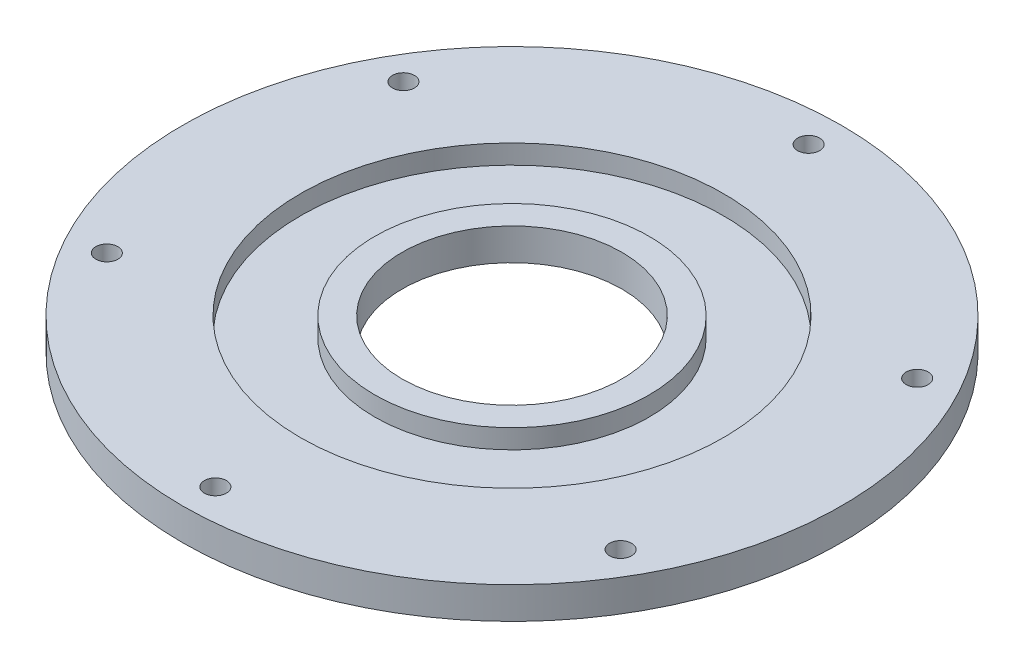
ISO-10303-21;
HEADER;
FILE_DESCRIPTION(('STEP AP214'),'2;1');
FILE_NAME('part.step','',(''),(''),'','','');
FILE_SCHEMA(('AUTOMOTIVE_DESIGN { 1 0 10303 214 1 1 1 1 }'));
ENDSEC;
DATA;
#1=APPLICATION_CONTEXT('core data for automotive mechanical design processes');
#2=APPLICATION_PROTOCOL_DEFINITION('international standard','automotive_design',2000,#1);
#3=PRODUCT_CONTEXT('',#1,'mechanical');
#4=PRODUCT('Part','Part','',(#3));
#5=PRODUCT_RELATED_PRODUCT_CATEGORY('part','',(#4));
#6=PRODUCT_DEFINITION_FORMATION('','',#4);
#7=PRODUCT_DEFINITION_CONTEXT('part definition',#1,'design');
#8=PRODUCT_DEFINITION('design','',#6,#7);
#9=PRODUCT_DEFINITION_SHAPE('','',#8);
#10=(LENGTH_UNIT() NAMED_UNIT(*) SI_UNIT(.MILLI.,.METRE.));
#11=(NAMED_UNIT(*) PLANE_ANGLE_UNIT() SI_UNIT($,.RADIAN.));
#12=(NAMED_UNIT(*) SI_UNIT($,.STERADIAN.) SOLID_ANGLE_UNIT());
#13=UNCERTAINTY_MEASURE_WITH_UNIT(LENGTH_MEASURE(1.E-05),#10,'distance_accuracy_value','');
#14=(GEOMETRIC_REPRESENTATION_CONTEXT(3) GLOBAL_UNCERTAINTY_ASSIGNED_CONTEXT((#13)) GLOBAL_UNIT_ASSIGNED_CONTEXT((#10,
#11,#12)) REPRESENTATION_CONTEXT('',''));
#15=CARTESIAN_POINT('',(0.,0.,0.));
#16=DIRECTION('',(0.,0.,1.));
#17=DIRECTION('',(1.,0.,0.));
#18=AXIS2_PLACEMENT_3D('',#15,#16,#17);
#19=CARTESIAN_POINT('',(0.,5.8,0.));
#20=DIRECTION('',(0.,1.,0.));
#21=DIRECTION('',(0.,0.,1.));
#22=AXIS2_PLACEMENT_3D('',#19,#20,#21);
#23=PLANE('',#22);
#24=CARTESIAN_POINT('',(0.,5.8,0.));
#25=DIRECTION('',(0.,1.,0.));
#26=DIRECTION('',(0.,0.,1.));
#27=AXIS2_PLACEMENT_3D('',#24,#25,#26);
#28=CIRCLE('',#27,20.);
#29=CARTESIAN_POINT('',(0.,5.8,20.));
#30=VERTEX_POINT('',#29);
#31=EDGE_CURVE('E43',#30,#30,#28,.T.);
#32=ORIENTED_EDGE('',*,*,#31,.F.);
#33=EDGE_LOOP('',(#32));
#34=FACE_BOUND('',#33,.T.);
#35=CARTESIAN_POINT('',(0.,5.8,0.));
#36=DIRECTION('',(0.,1.,0.));
#37=DIRECTION('',(0.,0.,1.));
#38=AXIS2_PLACEMENT_3D('',#35,#36,#37);
#39=CIRCLE('',#38,25.);
#40=CARTESIAN_POINT('',(0.,5.8,25.));
#41=VERTEX_POINT('',#40);
#42=EDGE_CURVE('E57',#41,#41,#39,.T.);
#43=ORIENTED_EDGE('',*,*,#42,.T.);
#44=EDGE_LOOP('',(#43));
#45=FACE_BOUND('',#44,.T.);
#46=ADVANCED_FACE('F32',(#34,#45),#23,.T.);
#47=CARTESIAN_POINT('',(0.,5.8,-54.));
#48=DIRECTION('',(0.,1.,0.));
#49=DIRECTION('',(0.,0.,1.));
#50=AXIS2_PLACEMENT_3D('',#47,#48,#49);
#51=CIRCLE('',#50,2.);
#52=CARTESIAN_POINT('',(0.,5.8,-52.));
#53=VERTEX_POINT('',#52);
#54=EDGE_CURVE('E88',#53,#53,#51,.T.);
#55=ORIENTED_EDGE('',*,*,#54,.F.);
#56=EDGE_LOOP('',(#55));
#57=FACE_BOUND('',#56,.T.);
#58=CARTESIAN_POINT('',(-46.7653718043585,5.8,-26.9999999999979));
#59=DIRECTION('',(0.,1.,0.));
#60=DIRECTION('',(0.,0.,1.));
#61=AXIS2_PLACEMENT_3D('',#58,#59,#60);
#62=CIRCLE('',#61,2.);
#63=CARTESIAN_POINT('',(-46.7653718043585,5.8,-24.9999999999979));
#64=VERTEX_POINT('',#63);
#65=EDGE_CURVE('E89',#64,#64,#62,.T.);
#66=ORIENTED_EDGE('',*,*,#65,.F.);
#67=EDGE_LOOP('',(#66));
#68=FACE_BOUND('',#67,.T.);
#69=CARTESIAN_POINT('',(-46.7653718043561,5.8,27.0000000000021));
#70=DIRECTION('',(0.,1.,0.));
#71=DIRECTION('',(0.,0.,1.));
#72=AXIS2_PLACEMENT_3D('',#69,#70,#71);
#73=CIRCLE('',#72,2.);
#74=CARTESIAN_POINT('',(-46.7653718043561,5.8,29.0000000000021));
#75=VERTEX_POINT('',#74);
#76=EDGE_CURVE('E63',#75,#75,#73,.T.);
#77=ORIENTED_EDGE('',*,*,#76,.F.);
#78=EDGE_LOOP('',(#77));
#79=FACE_BOUND('',#78,.T.);
#80=CARTESIAN_POINT('',(4.82268944919495E-12,5.8,54.));
#81=DIRECTION('',(0.,1.,0.));
#82=DIRECTION('',(0.,0.,1.));
#83=AXIS2_PLACEMENT_3D('',#80,#81,#82);
#84=CIRCLE('',#83,2.);
#85=CARTESIAN_POINT('',(4.82268944919495E-12,5.8,56.));
#86=VERTEX_POINT('',#85);
#87=EDGE_CURVE('E70',#86,#86,#84,.T.);
#88=ORIENTED_EDGE('',*,*,#87,.F.);
#89=EDGE_LOOP('',(#88));
#90=FACE_BOUND('',#89,.T.);
#91=CARTESIAN_POINT('',(46.7653718043633,5.8,26.9999999999979));
#92=DIRECTION('',(0.,1.,0.));
#93=DIRECTION('',(0.,0.,1.));
#94=AXIS2_PLACEMENT_3D('',#91,#92,#93);
#95=CIRCLE('',#94,2.);
#96=CARTESIAN_POINT('',(46.7653718043633,5.8,28.9999999999979));
#97=VERTEX_POINT('',#96);
#98=EDGE_CURVE('E76',#97,#97,#95,.T.);
#99=ORIENTED_EDGE('',*,*,#98,.F.);
#100=EDGE_LOOP('',(#99));
#101=FACE_BOUND('',#100,.T.);
#102=CARTESIAN_POINT('',(46.7653718043609,5.8,-27.0000000000021));
#103=DIRECTION('',(0.,1.,0.));
#104=DIRECTION('',(0.,0.,1.));
#105=AXIS2_PLACEMENT_3D('',#102,#103,#104);
#106=CIRCLE('',#105,2.);
#107=CARTESIAN_POINT('',(46.7653718043609,5.8,-25.0000000000021));
#108=VERTEX_POINT('',#107);
#109=EDGE_CURVE('E82',#108,#108,#106,.T.);
#110=ORIENTED_EDGE('',*,*,#109,.F.);
#111=EDGE_LOOP('',(#110));
#112=FACE_BOUND('',#111,.T.);
#113=CARTESIAN_POINT('',(0.,5.8,0.));
#114=DIRECTION('',(0.,1.,0.));
#115=DIRECTION('',(0.,0.,1.));
#116=AXIS2_PLACEMENT_3D('',#113,#114,#115);
#117=CIRCLE('',#116,38.5);
#118=CARTESIAN_POINT('',(0.,5.8,38.5));
#119=VERTEX_POINT('',#118);
#120=EDGE_CURVE('E51',#119,#119,#117,.T.);
#121=ORIENTED_EDGE('',*,*,#120,.F.);
#122=EDGE_LOOP('',(#121));
#123=FACE_BOUND('',#122,.T.);
#124=CARTESIAN_POINT('',(0.,5.8,0.));
#125=DIRECTION('',(0.,1.,0.));
#126=DIRECTION('',(0.,0.,1.));
#127=AXIS2_PLACEMENT_3D('',#124,#125,#126);
#128=CIRCLE('',#127,60.);
#129=CARTESIAN_POINT('',(0.,5.8,60.));
#130=VERTEX_POINT('',#129);
#131=EDGE_CURVE('E10',#130,#130,#128,.T.);
#132=ORIENTED_EDGE('',*,*,#131,.T.);
#133=EDGE_LOOP('',(#132));
#134=FACE_BOUND('',#133,.T.);
#135=ADVANCED_FACE('F109',(#57,#68,#79,#90,#101,#112,#123,#134),#23,.T.);
#136=CARTESIAN_POINT('',(0.,0.,0.));
#137=DIRECTION('',(0.,1.,0.));
#138=DIRECTION('',(0.,0.,1.));
#139=AXIS2_PLACEMENT_3D('',#136,#137,#138);
#140=PLANE('',#139);
#141=CARTESIAN_POINT('',(0.,0.,-54.));
#142=DIRECTION('',(0.,1.,0.));
#143=DIRECTION('',(0.,0.,1.));
#144=AXIS2_PLACEMENT_3D('',#141,#142,#143);
#145=CIRCLE('',#144,2.);
#146=CARTESIAN_POINT('',(0.,0.,-52.));
#147=VERTEX_POINT('',#146);
#148=EDGE_CURVE('E60',#147,#147,#145,.T.);
#149=ORIENTED_EDGE('',*,*,#148,.T.);
#150=EDGE_LOOP('',(#149));
#151=FACE_BOUND('',#150,.T.);
#152=CARTESIAN_POINT('',(-46.7653718043585,0.,-26.9999999999979));
#153=DIRECTION('',(0.,1.,0.));
#154=DIRECTION('',(0.,0.,1.));
#155=AXIS2_PLACEMENT_3D('',#152,#153,#154);
#156=CIRCLE('',#155,2.);
#157=CARTESIAN_POINT('',(-46.7653718043585,0.,-24.9999999999979));
#158=VERTEX_POINT('',#157);
#159=EDGE_CURVE('E67',#158,#158,#156,.T.);
#160=ORIENTED_EDGE('',*,*,#159,.T.);
#161=EDGE_LOOP('',(#160));
#162=FACE_BOUND('',#161,.T.);
#163=CARTESIAN_POINT('',(-46.7653718043561,0.,27.0000000000021));
#164=DIRECTION('',(0.,1.,0.));
#165=DIRECTION('',(0.,0.,1.));
#166=AXIS2_PLACEMENT_3D('',#163,#164,#165);
#167=CIRCLE('',#166,2.);
#168=CARTESIAN_POINT('',(-46.7653718043561,0.,29.0000000000021));
#169=VERTEX_POINT('',#168);
#170=EDGE_CURVE('E66',#169,#169,#167,.T.);
#171=ORIENTED_EDGE('',*,*,#170,.T.);
#172=EDGE_LOOP('',(#171));
#173=FACE_BOUND('',#172,.T.);
#174=CARTESIAN_POINT('',(4.82268944919495E-12,0.,54.));
#175=DIRECTION('',(0.,1.,0.));
#176=DIRECTION('',(0.,0.,1.));
#177=AXIS2_PLACEMENT_3D('',#174,#175,#176);
#178=CIRCLE('',#177,2.);
#179=CARTESIAN_POINT('',(4.82268944919495E-12,0.,56.));
#180=VERTEX_POINT('',#179);
#181=EDGE_CURVE('E73',#180,#180,#178,.T.);
#182=ORIENTED_EDGE('',*,*,#181,.T.);
#183=EDGE_LOOP('',(#182));
#184=FACE_BOUND('',#183,.T.);
#185=CARTESIAN_POINT('',(46.7653718043633,0.,26.9999999999979));
#186=DIRECTION('',(0.,1.,0.));
#187=DIRECTION('',(0.,0.,1.));
#188=AXIS2_PLACEMENT_3D('',#185,#186,#187);
#189=CIRCLE('',#188,2.);
#190=CARTESIAN_POINT('',(46.7653718043633,0.,28.9999999999979));
#191=VERTEX_POINT('',#190);
#192=EDGE_CURVE('E79',#191,#191,#189,.T.);
#193=ORIENTED_EDGE('',*,*,#192,.T.);
#194=EDGE_LOOP('',(#193));
#195=FACE_BOUND('',#194,.T.);
#196=CARTESIAN_POINT('',(46.7653718043609,0.,-27.0000000000021));
#197=DIRECTION('',(0.,1.,0.));
#198=DIRECTION('',(0.,0.,1.));
#199=AXIS2_PLACEMENT_3D('',#196,#197,#198);
#200=CIRCLE('',#199,2.);
#201=CARTESIAN_POINT('',(46.7653718043609,0.,-25.0000000000021));
#202=VERTEX_POINT('',#201);
#203=EDGE_CURVE('E85',#202,#202,#200,.T.);
#204=ORIENTED_EDGE('',*,*,#203,.T.);
#205=EDGE_LOOP('',(#204));
#206=FACE_BOUND('',#205,.T.);
#207=CARTESIAN_POINT('',(0.,0.,0.));
#208=DIRECTION('',(0.,1.,0.));
#209=DIRECTION('',(0.,0.,1.));
#210=AXIS2_PLACEMENT_3D('',#207,#208,#209);
#211=CIRCLE('',#210,60.);
#212=CARTESIAN_POINT('',(0.,0.,60.));
#213=VERTEX_POINT('',#212);
#214=EDGE_CURVE('E36',#213,#213,#211,.T.);
#215=ORIENTED_EDGE('',*,*,#214,.F.);
#216=EDGE_LOOP('',(#215));
#217=FACE_BOUND('',#216,.T.);
#218=CARTESIAN_POINT('',(0.,0.,0.));
#219=DIRECTION('',(0.,1.,0.));
#220=DIRECTION('',(0.,0.,1.));
#221=AXIS2_PLACEMENT_3D('',#218,#219,#220);
#222=CIRCLE('',#221,20.);
#223=CARTESIAN_POINT('',(0.,0.,20.));
#224=VERTEX_POINT('',#223);
#225=EDGE_CURVE('E45',#224,#224,#222,.T.);
#226=ORIENTED_EDGE('',*,*,#225,.T.);
#227=EDGE_LOOP('',(#226));
#228=FACE_BOUND('',#227,.T.);
#229=ADVANCED_FACE('F99',(#151,#162,#173,#184,#195,#206,#217,#228),#140,.F.);
#230=CARTESIAN_POINT('',(0.,5.8,0.));
#231=DIRECTION('',(0.,-1.,0.));
#232=DIRECTION('',(0.,0.,-1.));
#233=AXIS2_PLACEMENT_3D('',#230,#231,#232);
#234=CYLINDRICAL_SURFACE('',#233,60.);
#235=ORIENTED_EDGE('',*,*,#131,.F.);
#236=EDGE_LOOP('',(#235));
#237=FACE_BOUND('',#236,.T.);
#238=ORIENTED_EDGE('',*,*,#214,.T.);
#239=EDGE_LOOP('',(#238));
#240=FACE_BOUND('',#239,.T.);
#241=ADVANCED_FACE('F34',(#237,#240),#234,.T.);
#242=CARTESIAN_POINT('',(0.,5.8,0.));
#243=DIRECTION('',(0.,-1.,0.));
#244=DIRECTION('',(0.,0.,-1.));
#245=AXIS2_PLACEMENT_3D('',#242,#243,#244);
#246=CYLINDRICAL_SURFACE('',#245,20.);
#247=ORIENTED_EDGE('',*,*,#31,.T.);
#248=EDGE_LOOP('',(#247));
#249=FACE_BOUND('',#248,.T.);
#250=ORIENTED_EDGE('',*,*,#225,.F.);
#251=EDGE_LOOP('',(#250));
#252=FACE_BOUND('',#251,.T.);
#253=ADVANCED_FACE('F128',(#249,#252),#246,.F.);
#254=CARTESIAN_POINT('',(0.,2.3,0.));
#255=DIRECTION('',(0.,1.,0.));
#256=DIRECTION('',(0.,0.,1.));
#257=AXIS2_PLACEMENT_3D('',#254,#255,#256);
#258=CYLINDRICAL_SURFACE('',#257,38.5);
#259=CARTESIAN_POINT('',(0.,2.3,0.));
#260=DIRECTION('',(0.,1.,0.));
#261=DIRECTION('',(0.,0.,1.));
#262=AXIS2_PLACEMENT_3D('',#259,#260,#261);
#263=CIRCLE('',#262,38.5);
#264=CARTESIAN_POINT('',(0.,2.3,38.5));
#265=VERTEX_POINT('',#264);
#266=EDGE_CURVE('E48',#265,#265,#263,.T.);
#267=ORIENTED_EDGE('',*,*,#266,.F.);
#268=EDGE_LOOP('',(#267));
#269=FACE_BOUND('',#268,.T.);
#270=ORIENTED_EDGE('',*,*,#120,.T.);
#271=EDGE_LOOP('',(#270));
#272=FACE_BOUND('',#271,.T.);
#273=ADVANCED_FACE('F125',(#269,#272),#258,.F.);
#274=CARTESIAN_POINT('',(0.,2.3,0.));
#275=DIRECTION('',(0.,1.,0.));
#276=DIRECTION('',(0.,0.,1.));
#277=AXIS2_PLACEMENT_3D('',#274,#275,#276);
#278=PLANE('',#277);
#279=CARTESIAN_POINT('',(0.,2.3,0.));
#280=DIRECTION('',(0.,1.,0.));
#281=DIRECTION('',(0.,0.,1.));
#282=AXIS2_PLACEMENT_3D('',#279,#280,#281);
#283=CIRCLE('',#282,25.);
#284=CARTESIAN_POINT('',(0.,2.3,25.));
#285=VERTEX_POINT('',#284);
#286=EDGE_CURVE('E54',#285,#285,#283,.T.);
#287=ORIENTED_EDGE('',*,*,#286,.F.);
#288=EDGE_LOOP('',(#287));
#289=FACE_BOUND('',#288,.T.);
#290=ORIENTED_EDGE('',*,*,#266,.T.);
#291=EDGE_LOOP('',(#290));
#292=FACE_BOUND('',#291,.T.);
#293=ADVANCED_FACE('F127',(#289,#292),#278,.T.);
#294=CARTESIAN_POINT('',(0.,2.3,0.));
#295=DIRECTION('',(0.,1.,0.));
#296=DIRECTION('',(0.,0.,1.));
#297=AXIS2_PLACEMENT_3D('',#294,#295,#296);
#298=CYLINDRICAL_SURFACE('',#297,25.);
#299=ORIENTED_EDGE('',*,*,#286,.T.);
#300=EDGE_LOOP('',(#299));
#301=FACE_BOUND('',#300,.T.);
#302=ORIENTED_EDGE('',*,*,#42,.F.);
#303=EDGE_LOOP('',(#302));
#304=FACE_BOUND('',#303,.T.);
#305=ADVANCED_FACE('F135',(#301,#304),#298,.T.);
#306=CARTESIAN_POINT('',(46.7653718043609,0.,-27.0000000000021));
#307=DIRECTION('',(0.,1.,0.));
#308=DIRECTION('',(0.,0.,1.));
#309=AXIS2_PLACEMENT_3D('',#306,#307,#308);
#310=CYLINDRICAL_SURFACE('',#309,2.);
#311=ORIENTED_EDGE('',*,*,#203,.F.);
#312=EDGE_LOOP('',(#311));
#313=FACE_BOUND('',#312,.T.);
#314=ORIENTED_EDGE('',*,*,#109,.T.);
#315=EDGE_LOOP('',(#314));
#316=FACE_BOUND('',#315,.T.);
#317=ADVANCED_FACE('F187',(#313,#316),#310,.F.);
#318=CARTESIAN_POINT('',(46.7653718043633,0.,26.9999999999979));
#319=DIRECTION('',(0.,1.,0.));
#320=DIRECTION('',(0.,0.,1.));
#321=AXIS2_PLACEMENT_3D('',#318,#319,#320);
#322=CYLINDRICAL_SURFACE('',#321,2.);
#323=ORIENTED_EDGE('',*,*,#192,.F.);
#324=EDGE_LOOP('',(#323));
#325=FACE_BOUND('',#324,.T.);
#326=ORIENTED_EDGE('',*,*,#98,.T.);
#327=EDGE_LOOP('',(#326));
#328=FACE_BOUND('',#327,.T.);
#329=ADVANCED_FACE('F207',(#325,#328),#322,.F.);
#330=CARTESIAN_POINT('',(4.82268944919495E-12,0.,54.));
#331=DIRECTION('',(0.,1.,0.));
#332=DIRECTION('',(0.,0.,1.));
#333=AXIS2_PLACEMENT_3D('',#330,#331,#332);
#334=CYLINDRICAL_SURFACE('',#333,2.);
#335=ORIENTED_EDGE('',*,*,#181,.F.);
#336=EDGE_LOOP('',(#335));
#337=FACE_BOUND('',#336,.T.);
#338=ORIENTED_EDGE('',*,*,#87,.T.);
#339=EDGE_LOOP('',(#338));
#340=FACE_BOUND('',#339,.T.);
#341=ADVANCED_FACE('F217',(#337,#340),#334,.F.);
#342=CARTESIAN_POINT('',(-46.7653718043561,0.,27.0000000000021));
#343=DIRECTION('',(0.,1.,0.));
#344=DIRECTION('',(0.,0.,1.));
#345=AXIS2_PLACEMENT_3D('',#342,#343,#344);
#346=CYLINDRICAL_SURFACE('',#345,2.);
#347=ORIENTED_EDGE('',*,*,#170,.F.);
#348=EDGE_LOOP('',(#347));
#349=FACE_BOUND('',#348,.T.);
#350=ORIENTED_EDGE('',*,*,#76,.T.);
#351=EDGE_LOOP('',(#350));
#352=FACE_BOUND('',#351,.T.);
#353=ADVANCED_FACE('F227',(#349,#352),#346,.F.);
#354=CARTESIAN_POINT('',(-46.7653718043585,0.,-26.9999999999979));
#355=DIRECTION('',(0.,1.,0.));
#356=DIRECTION('',(0.,0.,1.));
#357=AXIS2_PLACEMENT_3D('',#354,#355,#356);
#358=CYLINDRICAL_SURFACE('',#357,2.);
#359=ORIENTED_EDGE('',*,*,#159,.F.);
#360=EDGE_LOOP('',(#359));
#361=FACE_BOUND('',#360,.T.);
#362=ORIENTED_EDGE('',*,*,#65,.T.);
#363=EDGE_LOOP('',(#362));
#364=FACE_BOUND('',#363,.T.);
#365=ADVANCED_FACE('F105',(#361,#364),#358,.F.);
#366=CARTESIAN_POINT('',(0.,0.,-54.));
#367=DIRECTION('',(0.,1.,0.));
#368=DIRECTION('',(0.,0.,1.));
#369=AXIS2_PLACEMENT_3D('',#366,#367,#368);
#370=CYLINDRICAL_SURFACE('',#369,2.);
#371=ORIENTED_EDGE('',*,*,#148,.F.);
#372=EDGE_LOOP('',(#371));
#373=FACE_BOUND('',#372,.T.);
#374=ORIENTED_EDGE('',*,*,#54,.T.);
#375=EDGE_LOOP('',(#374));
#376=FACE_BOUND('',#375,.T.);
#377=ADVANCED_FACE('F102',(#373,#376),#370,.F.);
#378=CLOSED_SHELL('',(#46,#135,#229,#241,#253,#273,#293,#305,#317,#329,#341,#353,#365,#377));
#379=MANIFOLD_SOLID_BREP('B2',#378);
#380=ADVANCED_BREP_SHAPE_REPRESENTATION('',(#18,#379),#14);
#381=SHAPE_DEFINITION_REPRESENTATION(#9,#380);
ENDSEC;
END-ISO-10303-21;
